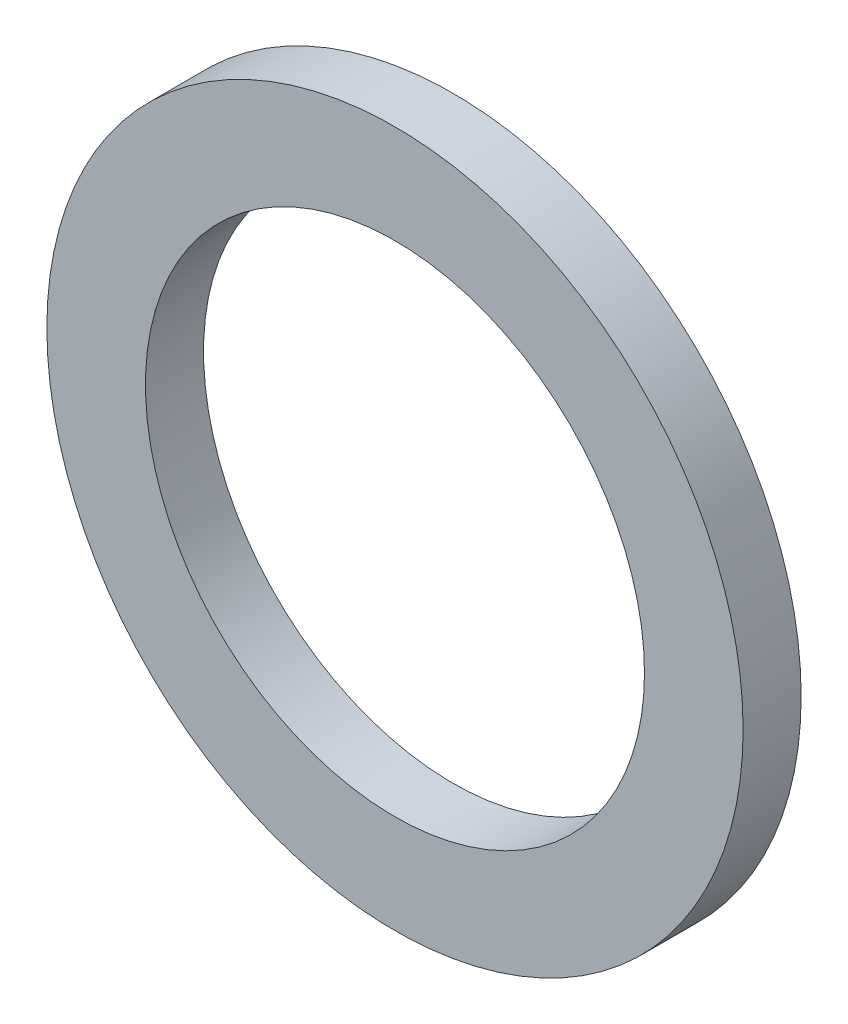
ISO-10303-21;
HEADER;
FILE_DESCRIPTION(('STEP AP214'),'2;1');
FILE_NAME('part.step','',(''),(''),'','','');
FILE_SCHEMA(('AUTOMOTIVE_DESIGN { 1 0 10303 214 1 1 1 1 }'));
ENDSEC;
DATA;
#1=APPLICATION_CONTEXT('core data for automotive mechanical design processes');
#2=APPLICATION_PROTOCOL_DEFINITION('international standard','automotive_design',2000,#1);
#3=PRODUCT_CONTEXT('',#1,'mechanical');
#4=PRODUCT('Part','Part','',(#3));
#5=PRODUCT_RELATED_PRODUCT_CATEGORY('part','',(#4));
#6=PRODUCT_DEFINITION_FORMATION('','',#4);
#7=PRODUCT_DEFINITION_CONTEXT('part definition',#1,'design');
#8=PRODUCT_DEFINITION('design','',#6,#7);
#9=PRODUCT_DEFINITION_SHAPE('','',#8);
#10=(LENGTH_UNIT() NAMED_UNIT(*) SI_UNIT(.MILLI.,.METRE.));
#11=(NAMED_UNIT(*) PLANE_ANGLE_UNIT() SI_UNIT($,.RADIAN.));
#12=(NAMED_UNIT(*) SI_UNIT($,.STERADIAN.) SOLID_ANGLE_UNIT());
#13=UNCERTAINTY_MEASURE_WITH_UNIT(LENGTH_MEASURE(1.E-05),#10,'distance_accuracy_value','');
#14=(GEOMETRIC_REPRESENTATION_CONTEXT(3) GLOBAL_UNCERTAINTY_ASSIGNED_CONTEXT((#13)) GLOBAL_UNIT_ASSIGNED_CONTEXT((#10,
#11,#12)) REPRESENTATION_CONTEXT('',''));
#15=CARTESIAN_POINT('',(0.,0.,0.));
#16=DIRECTION('',(0.,0.,1.));
#17=DIRECTION('',(1.,0.,0.));
#18=AXIS2_PLACEMENT_3D('',#15,#16,#17);
#19=CARTESIAN_POINT('',(0.,0.,0.5));
#20=DIRECTION('',(0.,0.,1.));
#21=DIRECTION('',(1.,0.,0.));
#22=AXIS2_PLACEMENT_3D('',#19,#20,#21);
#23=PLANE('',#22);
#24=CARTESIAN_POINT('',(0.,0.,0.5));
#25=DIRECTION('',(0.,0.,1.));
#26=DIRECTION('',(1.,0.,0.));
#27=AXIS2_PLACEMENT_3D('',#24,#25,#26);
#28=CIRCLE('',#27,3.);
#29=CARTESIAN_POINT('',(3.,0.,0.5));
#30=VERTEX_POINT('',#29);
#31=EDGE_CURVE('E10',#30,#30,#28,.T.);
#32=ORIENTED_EDGE('',*,*,#31,.T.);
#33=EDGE_LOOP('',(#32));
#34=FACE_BOUND('',#33,.T.);
#35=CARTESIAN_POINT('',(0.,0.,0.5));
#36=DIRECTION('',(0.,0.,1.));
#37=DIRECTION('',(1.,0.,0.));
#38=AXIS2_PLACEMENT_3D('',#35,#36,#37);
#39=CIRCLE('',#38,2.15);
#40=CARTESIAN_POINT('',(2.15,0.,0.5));
#41=VERTEX_POINT('',#40);
#42=EDGE_CURVE('E56',#41,#41,#39,.T.);
#43=ORIENTED_EDGE('',*,*,#42,.F.);
#44=EDGE_LOOP('',(#43));
#45=FACE_BOUND('',#44,.T.);
#46=ADVANCED_FACE('F39',(#34,#45),#23,.T.);
#47=CARTESIAN_POINT('',(0.,0.,0.));
#48=DIRECTION('',(0.,0.,1.));
#49=DIRECTION('',(1.,0.,0.));
#50=AXIS2_PLACEMENT_3D('',#47,#48,#49);
#51=PLANE('',#50);
#52=CARTESIAN_POINT('',(0.,0.,0.));
#53=DIRECTION('',(0.,0.,1.));
#54=DIRECTION('',(1.,0.,0.));
#55=AXIS2_PLACEMENT_3D('',#52,#53,#54);
#56=CIRCLE('',#55,3.);
#57=CARTESIAN_POINT('',(3.,0.,0.));
#58=VERTEX_POINT('',#57);
#59=EDGE_CURVE('E43',#58,#58,#56,.T.);
#60=ORIENTED_EDGE('',*,*,#59,.F.);
#61=EDGE_LOOP('',(#60));
#62=FACE_BOUND('',#61,.T.);
#63=CARTESIAN_POINT('',(0.,0.,0.));
#64=DIRECTION('',(0.,0.,1.));
#65=DIRECTION('',(1.,0.,0.));
#66=AXIS2_PLACEMENT_3D('',#63,#64,#65);
#67=CIRCLE('',#66,2.15);
#68=CARTESIAN_POINT('',(2.15,0.,0.));
#69=VERTEX_POINT('',#68);
#70=EDGE_CURVE('E58',#69,#69,#67,.T.);
#71=ORIENTED_EDGE('',*,*,#70,.T.);
#72=EDGE_LOOP('',(#71));
#73=FACE_BOUND('',#72,.T.);
#74=ADVANCED_FACE('F71',(#62,#73),#51,.F.);
#75=CARTESIAN_POINT('',(0.,0.,0.5));
#76=DIRECTION('',(0.,0.,-1.));
#77=DIRECTION('',(-1.,0.,0.));
#78=AXIS2_PLACEMENT_3D('',#75,#76,#77);
#79=CYLINDRICAL_SURFACE('',#78,3.);
#80=ORIENTED_EDGE('',*,*,#31,.F.);
#81=EDGE_LOOP('',(#80));
#82=FACE_BOUND('',#81,.T.);
#83=ORIENTED_EDGE('',*,*,#59,.T.);
#84=EDGE_LOOP('',(#83));
#85=FACE_BOUND('',#84,.T.);
#86=ADVANCED_FACE('F41',(#82,#85),#79,.T.);
#87=CARTESIAN_POINT('',(0.,0.,0.5));
#88=DIRECTION('',(0.,0.,-1.));
#89=DIRECTION('',(-1.,0.,0.));
#90=AXIS2_PLACEMENT_3D('',#87,#88,#89);
#91=CYLINDRICAL_SURFACE('',#90,2.15);
#92=ORIENTED_EDGE('',*,*,#42,.T.);
#93=EDGE_LOOP('',(#92));
#94=FACE_BOUND('',#93,.T.);
#95=ORIENTED_EDGE('',*,*,#70,.F.);
#96=EDGE_LOOP('',(#95));
#97=FACE_BOUND('',#96,.T.);
#98=ADVANCED_FACE('F67',(#94,#97),#91,.F.);
#99=CLOSED_SHELL('',(#46,#74,#86,#98));
#100=MANIFOLD_SOLID_BREP('B2',#99);
#101=ADVANCED_BREP_SHAPE_REPRESENTATION('',(#18,#100),#14);
#102=SHAPE_DEFINITION_REPRESENTATION(#9,#101);
ENDSEC;
END-ISO-10303-21;
